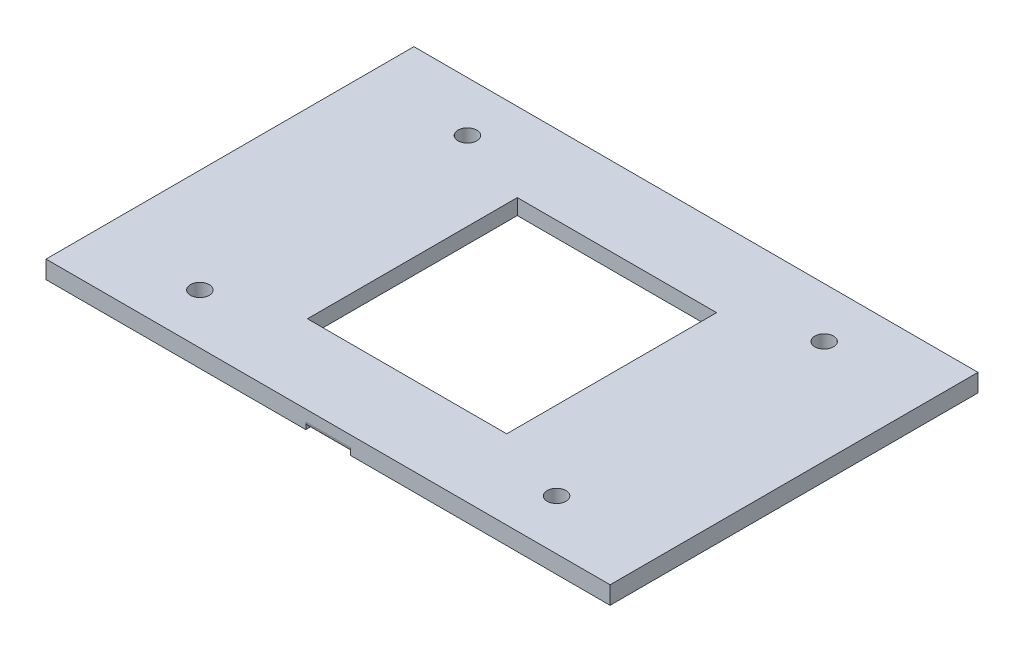
ISO-10303-21;
HEADER;
FILE_DESCRIPTION(('STEP AP214'),'2;1');
FILE_NAME('part.step','',(''),(''),'','','');
FILE_SCHEMA(('AUTOMOTIVE_DESIGN { 1 0 10303 214 1 1 1 1 }'));
ENDSEC;
DATA;
#1=APPLICATION_CONTEXT('core data for automotive mechanical design processes');
#2=APPLICATION_PROTOCOL_DEFINITION('international standard','automotive_design',2000,#1);
#3=PRODUCT_CONTEXT('',#1,'mechanical');
#4=PRODUCT('Part','Part','',(#3));
#5=PRODUCT_RELATED_PRODUCT_CATEGORY('part','',(#4));
#6=PRODUCT_DEFINITION_FORMATION('','',#4);
#7=PRODUCT_DEFINITION_CONTEXT('part definition',#1,'design');
#8=PRODUCT_DEFINITION('design','',#6,#7);
#9=PRODUCT_DEFINITION_SHAPE('','',#8);
#10=(LENGTH_UNIT() NAMED_UNIT(*) SI_UNIT(.MILLI.,.METRE.));
#11=(NAMED_UNIT(*) PLANE_ANGLE_UNIT() SI_UNIT($,.RADIAN.));
#12=(NAMED_UNIT(*) SI_UNIT($,.STERADIAN.) SOLID_ANGLE_UNIT());
#13=UNCERTAINTY_MEASURE_WITH_UNIT(LENGTH_MEASURE(1.E-05),#10,'distance_accuracy_value','');
#14=(GEOMETRIC_REPRESENTATION_CONTEXT(3) GLOBAL_UNCERTAINTY_ASSIGNED_CONTEXT((#13)) GLOBAL_UNIT_ASSIGNED_CONTEXT((#10,
#11,#12)) REPRESENTATION_CONTEXT('',''));
#15=CARTESIAN_POINT('',(0.,0.,0.));
#16=DIRECTION('',(0.,0.,1.));
#17=DIRECTION('',(1.,0.,0.));
#18=AXIS2_PLACEMENT_3D('',#15,#16,#17);
#19=CARTESIAN_POINT('',(0.,56.6459742680589,0.));
#20=DIRECTION('',(0.,-1.,0.));
#21=DIRECTION('',(0.,0.,-1.));
#22=AXIS2_PLACEMENT_3D('',#19,#20,#21);
#23=PLANE('',#22);
#24=DIRECTION('',(0.,0.,1.));
#25=VECTOR('',#24,1.);
#26=CARTESIAN_POINT('',(69.8089806938948,56.6459742680589,0.));
#27=LINE('',#26,#25);
#28=CARTESIAN_POINT('',(69.8089806938948,56.6459742680589,121.523129836377));
#29=VERTEX_POINT('',#28);
#30=CARTESIAN_POINT('',(69.8089806938948,56.6459742680589,130.773129836377));
#31=VERTEX_POINT('',#30);
#32=EDGE_CURVE('E322',#29,#31,#27,.T.);
#33=ORIENTED_EDGE('',*,*,#32,.F.);
#34=DIRECTION('',(1.,0.,0.));
#35=VECTOR('',#34,1.);
#36=CARTESIAN_POINT('',(0.,56.6459742680589,121.523129836377));
#37=LINE('',#36,#35);
#38=CARTESIAN_POINT('',(96.8089806938948,56.6459742680589,121.523129836377));
#39=VERTEX_POINT('',#38);
#40=EDGE_CURVE('E319',#29,#39,#37,.T.);
#41=ORIENTED_EDGE('',*,*,#40,.T.);
#42=DIRECTION('',(0.,0.,-1.));
#43=VECTOR('',#42,1.);
#44=CARTESIAN_POINT('',(96.8089806938948,56.6459742680589,0.));
#45=LINE('',#44,#43);
#46=CARTESIAN_POINT('',(96.8089806938948,56.6459742680589,94.5231298363772));
#47=VERTEX_POINT('',#46);
#48=EDGE_CURVE('E316',#39,#47,#45,.T.);
#49=ORIENTED_EDGE('',*,*,#48,.T.);
#50=DIRECTION('',(-1.,0.,0.));
#51=VECTOR('',#50,1.);
#52=CARTESIAN_POINT('',(0.,56.6459742680589,94.5231298363772));
#53=LINE('',#52,#51);
#54=CARTESIAN_POINT('',(116.808980693895,56.6459742680589,94.5231298363772));
#55=VERTEX_POINT('',#54);
#56=EDGE_CURVE('E313',#55,#47,#53,.T.);
#57=ORIENTED_EDGE('',*,*,#56,.F.);
#58=DIRECTION('',(0.,0.,1.));
#59=VECTOR('',#58,1.);
#60=CARTESIAN_POINT('',(116.808980693895,56.6459742680589,0.));
#61=LINE('',#60,#59);
#62=CARTESIAN_POINT('',(116.808980693895,56.6459742680589,84.5231298363773));
#63=VERTEX_POINT('',#62);
#64=EDGE_CURVE('E310',#63,#55,#61,.T.);
#65=ORIENTED_EDGE('',*,*,#64,.F.);
#66=DIRECTION('',(1.,0.,0.));
#67=VECTOR('',#66,1.);
#68=CARTESIAN_POINT('',(0.,56.6459742680589,84.5231298363773));
#69=LINE('',#68,#67);
#70=CARTESIAN_POINT('',(96.8089806938948,56.6459742680589,84.5231298363773));
#71=VERTEX_POINT('',#70);
#72=EDGE_CURVE('E307',#71,#63,#69,.T.);
#73=ORIENTED_EDGE('',*,*,#72,.F.);
#74=DIRECTION('',(0.,0.,-1.));
#75=VECTOR('',#74,1.);
#76=CARTESIAN_POINT('',(96.8089806938948,56.6459742680589,0.));
#77=LINE('',#76,#75);
#78=CARTESIAN_POINT('',(96.8089806938948,56.6459742680589,57.5231298363773));
#79=VERTEX_POINT('',#78);
#80=EDGE_CURVE('E304',#71,#79,#77,.T.);
#81=ORIENTED_EDGE('',*,*,#80,.T.);
#82=DIRECTION('',(-1.,0.,0.));
#83=VECTOR('',#82,1.);
#84=CARTESIAN_POINT('',(0.,56.6459742680589,57.5231298363773));
#85=LINE('',#84,#83);
#86=CARTESIAN_POINT('',(69.8089806938948,56.6459742680589,57.5231298363773));
#87=VERTEX_POINT('',#86);
#88=EDGE_CURVE('E301',#79,#87,#85,.T.);
#89=ORIENTED_EDGE('',*,*,#88,.T.);
#90=DIRECTION('',(0.,0.,-1.));
#91=VECTOR('',#90,1.);
#92=CARTESIAN_POINT('',(69.8089806938948,56.6459742680589,0.));
#93=LINE('',#92,#91);
#94=CARTESIAN_POINT('',(69.8089806938948,56.6459742680589,48.2731298363773));
#95=VERTEX_POINT('',#94);
#96=EDGE_CURVE('E298',#87,#95,#93,.T.);
#97=ORIENTED_EDGE('',*,*,#96,.T.);
#98=DIRECTION('',(1.,0.,0.));
#99=VECTOR('',#98,1.);
#100=CARTESIAN_POINT('',(1.55898069389482,56.6459742680589,48.2731298363773));
#101=LINE('',#100,#99);
#102=CARTESIAN_POINT('',(128.058980693895,56.6459742680589,48.2731298363773));
#103=VERTEX_POINT('',#102);
#104=EDGE_CURVE('E438',#95,#103,#101,.T.);
#105=ORIENTED_EDGE('',*,*,#104,.T.);
#106=DIRECTION('',(0.,0.,1.));
#107=VECTOR('',#106,1.);
#108=CARTESIAN_POINT('',(128.058980693895,56.6459742680589,48.2731298363773));
#109=LINE('',#108,#107);
#110=CARTESIAN_POINT('',(128.058980693895,56.6459742680589,130.773129836377));
#111=VERTEX_POINT('',#110);
#112=EDGE_CURVE('E437',#103,#111,#109,.T.);
#113=ORIENTED_EDGE('',*,*,#112,.T.);
#114=DIRECTION('',(-1.,0.,0.));
#115=VECTOR('',#114,1.);
#116=CARTESIAN_POINT('',(128.058980693895,56.6459742680589,130.773129836377));
#117=LINE('',#116,#115);
#118=EDGE_CURVE('E441',#111,#31,#117,.T.);
#119=ORIENTED_EDGE('',*,*,#118,.T.);
#120=EDGE_LOOP('',(#33,#41,#49,#57,#65,#73,#81,#89,#97,#105,#113,#119));
#121=FACE_BOUND('',#120,.T.);
#122=CARTESIAN_POINT('',(104.808980693895,56.6459742680589,119.523129836377));
#123=DIRECTION('',(0.,-1.,0.));
#124=DIRECTION('',(0.,0.,-1.));
#125=AXIS2_PLACEMENT_3D('',#122,#123,#124);
#126=CIRCLE('',#125,2.1);
#127=CARTESIAN_POINT('',(104.808980693895,56.6459742680589,117.423129836377));
#128=VERTEX_POINT('',#127);
#129=EDGE_CURVE('E390',#128,#128,#126,.T.);
#130=ORIENTED_EDGE('',*,*,#129,.F.);
#131=EDGE_LOOP('',(#130));
#132=FACE_BOUND('',#131,.T.);
#133=CARTESIAN_POINT('',(104.808980693895,56.6459742680589,59.5231298363773));
#134=DIRECTION('',(0.,-1.,0.));
#135=DIRECTION('',(0.,0.,-1.));
#136=AXIS2_PLACEMENT_3D('',#133,#134,#135);
#137=CIRCLE('',#136,2.1);
#138=CARTESIAN_POINT('',(104.808980693895,56.6459742680589,57.4231298363772));
#139=VERTEX_POINT('',#138);
#140=EDGE_CURVE('E402',#139,#139,#137,.T.);
#141=ORIENTED_EDGE('',*,*,#140,.F.);
#142=EDGE_LOOP('',(#141));
#143=FACE_BOUND('',#142,.T.);
#144=ADVANCED_FACE('F33',(#121,#132,#143),#23,.T.);
#145=CARTESIAN_POINT('',(1.55898069389482,56.6459742680589,48.2731298363773));
#146=DIRECTION('',(0.,0.,1.));
#147=DIRECTION('',(1.,0.,0.));
#148=AXIS2_PLACEMENT_3D('',#145,#146,#147);
#149=PLANE('',#148);
#150=DIRECTION('',(-1.,0.,0.));
#151=VECTOR('',#150,1.);
#152=CARTESIAN_POINT('',(59.8089806938948,58.1459742680589,48.2731298363773));
#153=LINE('',#152,#151);
#154=CARTESIAN_POINT('',(69.8089806938948,58.1459742680589,48.2731298363773));
#155=VERTEX_POINT('',#154);
#156=CARTESIAN_POINT('',(59.8089806938948,58.1459742680589,48.2731298363773));
#157=VERTEX_POINT('',#156);
#158=EDGE_CURVE('E469',#155,#157,#153,.T.);
#159=ORIENTED_EDGE('',*,*,#158,.T.);
#160=DIRECTION('',(0.,-1.,0.));
#161=VECTOR('',#160,1.);
#162=CARTESIAN_POINT('',(59.8089806938948,57.1459742680589,48.2731298363773));
#163=LINE('',#162,#161);
#164=CARTESIAN_POINT('',(59.8089806938948,56.6459742680589,48.2731298363773));
#165=VERTEX_POINT('',#164);
#166=EDGE_CURVE('E240',#157,#165,#163,.T.);
#167=ORIENTED_EDGE('',*,*,#166,.T.);
#168=CARTESIAN_POINT('',(1.55898069389482,56.6459742680589,48.2731298363773));
#169=VERTEX_POINT('',#168);
#170=EDGE_CURVE('E434',#169,#165,#101,.T.);
#171=ORIENTED_EDGE('',*,*,#170,.F.);
#172=DIRECTION('',(0.,1.,0.));
#173=VECTOR('',#172,1.);
#174=CARTESIAN_POINT('',(1.55898069389482,56.6459742680589,48.2731298363773));
#175=LINE('',#174,#173);
#176=CARTESIAN_POINT('',(1.55898069389482,60.645974268059,48.2731298363773));
#177=VERTEX_POINT('',#176);
#178=EDGE_CURVE('E446',#169,#177,#175,.T.);
#179=ORIENTED_EDGE('',*,*,#178,.T.);
#180=DIRECTION('',(1.,0.,0.));
#181=VECTOR('',#180,1.);
#182=CARTESIAN_POINT('',(1.55898069389482,60.645974268059,48.2731298363773));
#183=LINE('',#182,#181);
#184=CARTESIAN_POINT('',(128.058980693895,60.645974268059,48.2731298363773));
#185=VERTEX_POINT('',#184);
#186=EDGE_CURVE('E433',#177,#185,#183,.T.);
#187=ORIENTED_EDGE('',*,*,#186,.T.);
#188=DIRECTION('',(0.,1.,0.));
#189=VECTOR('',#188,1.);
#190=CARTESIAN_POINT('',(128.058980693895,56.6459742680589,48.2731298363773));
#191=LINE('',#190,#189);
#192=EDGE_CURVE('E463',#103,#185,#191,.T.);
#193=ORIENTED_EDGE('',*,*,#192,.F.);
#194=ORIENTED_EDGE('',*,*,#104,.F.);
#195=DIRECTION('',(0.,-1.,0.));
#196=VECTOR('',#195,1.);
#197=CARTESIAN_POINT('',(69.8089806938948,57.1459742680589,48.2731298363773));
#198=LINE('',#197,#196);
#199=EDGE_CURVE('E377',#155,#95,#198,.T.);
#200=ORIENTED_EDGE('',*,*,#199,.F.);
#201=EDGE_LOOP('',(#159,#167,#171,#179,#187,#193,#194,#200));
#202=FACE_BOUND('',#201,.T.);
#203=ADVANCED_FACE('F515',(#202),#149,.F.);
#204=CARTESIAN_POINT('',(42.4667055457354,56.6459742680589,65.9891010956235));
#205=DIRECTION('',(0.,0.,1.));
#206=DIRECTION('',(1.,0.,0.));
#207=AXIS2_PLACEMENT_3D('',#204,#205,#206);
#208=PLANE('',#207);
#209=DIRECTION('',(0.,1.,0.));
#210=VECTOR('',#209,1.);
#211=CARTESIAN_POINT('',(42.4667055457354,56.6459742680589,65.9891010956235));
#212=LINE('',#211,#210);
#213=CARTESIAN_POINT('',(42.4667055457354,57.1459742680589,65.9891010956235));
#214=VERTEX_POINT('',#213);
#215=CARTESIAN_POINT('',(42.4667055457354,60.645974268059,65.9891010956235));
#216=VERTEX_POINT('',#215);
#217=EDGE_CURVE('E425',#214,#216,#212,.T.);
#218=ORIENTED_EDGE('',*,*,#217,.F.);
#219=DIRECTION('',(1.,0.,0.));
#220=VECTOR('',#219,1.);
#221=CARTESIAN_POINT('',(42.4667055457354,57.1459742680589,65.9891010956235));
#222=LINE('',#221,#220);
#223=CARTESIAN_POINT('',(87.1512558420543,57.1459742680589,65.9891010956236));
#224=VERTEX_POINT('',#223);
#225=EDGE_CURVE('E386',#214,#224,#222,.T.);
#226=ORIENTED_EDGE('',*,*,#225,.T.);
#227=DIRECTION('',(0.,1.,0.));
#228=VECTOR('',#227,1.);
#229=CARTESIAN_POINT('',(87.1512558420543,56.6459742680589,65.9891010956236));
#230=LINE('',#229,#228);
#231=CARTESIAN_POINT('',(87.1512558420543,60.645974268059,65.9891010956236));
#232=VERTEX_POINT('',#231);
#233=EDGE_CURVE('E431',#224,#232,#230,.T.);
#234=ORIENTED_EDGE('',*,*,#233,.T.);
#235=DIRECTION('',(1.,0.,0.));
#236=VECTOR('',#235,1.);
#237=CARTESIAN_POINT('',(42.4667055457354,60.645974268059,65.9891010956235));
#238=LINE('',#237,#236);
#239=EDGE_CURVE('E411',#216,#232,#238,.T.);
#240=ORIENTED_EDGE('',*,*,#239,.F.);
#241=EDGE_LOOP('',(#218,#226,#234,#240));
#242=FACE_BOUND('',#241,.T.);
#243=ADVANCED_FACE('F581',(#242),#208,.T.);
#244=CARTESIAN_POINT('',(87.1512558420543,56.6459742680589,65.9891010956236));
#245=DIRECTION('',(-1.,0.,0.));
#246=DIRECTION('',(0.,0.,1.));
#247=AXIS2_PLACEMENT_3D('',#244,#245,#246);
#248=PLANE('',#247);
#249=ORIENTED_EDGE('',*,*,#233,.F.);
#250=DIRECTION('',(0.,0.,1.));
#251=VECTOR('',#250,1.);
#252=CARTESIAN_POINT('',(87.1512558420543,57.1459742680589,65.9891010956236));
#253=LINE('',#252,#251);
#254=CARTESIAN_POINT('',(87.1512558420543,57.1459742680589,113.057158577131));
#255=VERTEX_POINT('',#254);
#256=EDGE_CURVE('E383',#224,#255,#253,.T.);
#257=ORIENTED_EDGE('',*,*,#256,.T.);
#258=DIRECTION('',(0.,1.,0.));
#259=VECTOR('',#258,1.);
#260=CARTESIAN_POINT('',(87.1512558420543,56.6459742680589,113.057158577131));
#261=LINE('',#260,#259);
#262=CARTESIAN_POINT('',(87.1512558420543,60.645974268059,113.057158577131));
#263=VERTEX_POINT('',#262);
#264=EDGE_CURVE('E429',#255,#263,#261,.T.);
#265=ORIENTED_EDGE('',*,*,#264,.T.);
#266=DIRECTION('',(0.,0.,1.));
#267=VECTOR('',#266,1.);
#268=CARTESIAN_POINT('',(87.1512558420543,60.645974268059,65.9891010956236));
#269=LINE('',#268,#267);
#270=EDGE_CURVE('E416',#232,#263,#269,.T.);
#271=ORIENTED_EDGE('',*,*,#270,.F.);
#272=EDGE_LOOP('',(#249,#257,#265,#271));
#273=FACE_BOUND('',#272,.T.);
#274=ADVANCED_FACE('F596',(#273),#248,.T.);
#275=CARTESIAN_POINT('',(87.1512558420543,56.6459742680589,113.057158577131));
#276=DIRECTION('',(0.,0.,-1.));
#277=DIRECTION('',(-1.,0.,0.));
#278=AXIS2_PLACEMENT_3D('',#275,#276,#277);
#279=PLANE('',#278);
#280=ORIENTED_EDGE('',*,*,#264,.F.);
#281=DIRECTION('',(-1.,0.,0.));
#282=VECTOR('',#281,1.);
#283=CARTESIAN_POINT('',(87.1512558420543,57.1459742680589,113.057158577131));
#284=LINE('',#283,#282);
#285=CARTESIAN_POINT('',(42.4667055457354,57.1459742680589,113.057158577131));
#286=VERTEX_POINT('',#285);
#287=EDGE_CURVE('E346',#255,#286,#284,.T.);
#288=ORIENTED_EDGE('',*,*,#287,.T.);
#289=DIRECTION('',(0.,1.,0.));
#290=VECTOR('',#289,1.);
#291=CARTESIAN_POINT('',(42.4667055457354,56.6459742680589,113.057158577131));
#292=LINE('',#291,#290);
#293=CARTESIAN_POINT('',(42.4667055457354,60.645974268059,113.057158577131));
#294=VERTEX_POINT('',#293);
#295=EDGE_CURVE('E427',#286,#294,#292,.T.);
#296=ORIENTED_EDGE('',*,*,#295,.T.);
#297=DIRECTION('',(-1.,0.,0.));
#298=VECTOR('',#297,1.);
#299=CARTESIAN_POINT('',(87.1512558420543,60.645974268059,113.057158577131));
#300=LINE('',#299,#298);
#301=EDGE_CURVE('E419',#263,#294,#300,.T.);
#302=ORIENTED_EDGE('',*,*,#301,.F.);
#303=EDGE_LOOP('',(#280,#288,#296,#302));
#304=FACE_BOUND('',#303,.T.);
#305=ADVANCED_FACE('F590',(#304),#279,.T.);
#306=CARTESIAN_POINT('',(42.4667055457354,56.6459742680589,113.057158577131));
#307=DIRECTION('',(1.,0.,0.));
#308=DIRECTION('',(0.,0.,-1.));
#309=AXIS2_PLACEMENT_3D('',#306,#307,#308);
#310=PLANE('',#309);
#311=ORIENTED_EDGE('',*,*,#295,.F.);
#312=DIRECTION('',(0.,0.,-1.));
#313=VECTOR('',#312,1.);
#314=CARTESIAN_POINT('',(42.4667055457354,57.1459742680589,113.057158577131));
#315=LINE('',#314,#313);
#316=EDGE_CURVE('E466',#286,#214,#315,.T.);
#317=ORIENTED_EDGE('',*,*,#316,.T.);
#318=ORIENTED_EDGE('',*,*,#217,.T.);
#319=DIRECTION('',(0.,0.,-1.));
#320=VECTOR('',#319,1.);
#321=CARTESIAN_POINT('',(42.4667055457354,60.645974268059,113.057158577131));
#322=LINE('',#321,#320);
#323=EDGE_CURVE('E422',#294,#216,#322,.T.);
#324=ORIENTED_EDGE('',*,*,#323,.F.);
#325=EDGE_LOOP('',(#311,#317,#318,#324));
#326=FACE_BOUND('',#325,.T.);
#327=ADVANCED_FACE('F585',(#326),#310,.T.);
#328=DIRECTION('',(0.,0.,-1.));
#329=VECTOR('',#328,1.);
#330=CARTESIAN_POINT('',(59.8089806938948,56.6459742680589,0.));
#331=LINE('',#330,#329);
#332=CARTESIAN_POINT('',(59.8089806938948,56.6459742680589,130.773129836377));
#333=VERTEX_POINT('',#332);
#334=CARTESIAN_POINT('',(59.8089806938948,56.6459742680589,121.523129836377));
#335=VERTEX_POINT('',#334);
#336=EDGE_CURVE('E324',#333,#335,#331,.T.);
#337=ORIENTED_EDGE('',*,*,#336,.F.);
#338=CARTESIAN_POINT('',(1.55898069389482,56.6459742680589,130.773129836377));
#339=VERTEX_POINT('',#338);
#340=EDGE_CURVE('E440',#333,#339,#117,.T.);
#341=ORIENTED_EDGE('',*,*,#340,.T.);
#342=DIRECTION('',(0.,0.,-1.));
#343=VECTOR('',#342,1.);
#344=CARTESIAN_POINT('',(1.55898069389482,56.6459742680589,130.773129836377));
#345=LINE('',#344,#343);
#346=EDGE_CURVE('E444',#339,#169,#345,.T.);
#347=ORIENTED_EDGE('',*,*,#346,.T.);
#348=ORIENTED_EDGE('',*,*,#170,.T.);
#349=DIRECTION('',(0.,0.,-1.));
#350=VECTOR('',#349,1.);
#351=CARTESIAN_POINT('',(59.8089806938948,56.6459742680589,0.));
#352=LINE('',#351,#350);
#353=CARTESIAN_POINT('',(59.8089806938948,56.6459742680589,57.5231298363773));
#354=VERTEX_POINT('',#353);
#355=EDGE_CURVE('E296',#354,#165,#352,.T.);
#356=ORIENTED_EDGE('',*,*,#355,.F.);
#357=DIRECTION('',(-1.,0.,0.));
#358=VECTOR('',#357,1.);
#359=CARTESIAN_POINT('',(0.,56.6459742680589,57.5231298363773));
#360=LINE('',#359,#358);
#361=CARTESIAN_POINT('',(32.8089806938948,56.6459742680589,57.5231298363773));
#362=VERTEX_POINT('',#361);
#363=EDGE_CURVE('E236',#354,#362,#360,.T.);
#364=ORIENTED_EDGE('',*,*,#363,.T.);
#365=DIRECTION('',(0.,0.,1.));
#366=VECTOR('',#365,1.);
#367=CARTESIAN_POINT('',(32.8089806938948,56.6459742680589,0.));
#368=LINE('',#367,#366);
#369=CARTESIAN_POINT('',(32.8089806938948,56.6459742680589,84.5231298363773));
#370=VERTEX_POINT('',#369);
#371=EDGE_CURVE('E249',#362,#370,#368,.T.);
#372=ORIENTED_EDGE('',*,*,#371,.T.);
#373=DIRECTION('',(1.,0.,0.));
#374=VECTOR('',#373,1.);
#375=CARTESIAN_POINT('',(0.,56.6459742680589,84.5231298363773));
#376=LINE('',#375,#374);
#377=CARTESIAN_POINT('',(12.8089806938948,56.6459742680589,84.5231298363773));
#378=VERTEX_POINT('',#377);
#379=EDGE_CURVE('E339',#378,#370,#376,.T.);
#380=ORIENTED_EDGE('',*,*,#379,.F.);
#381=DIRECTION('',(0.,0.,-1.));
#382=VECTOR('',#381,1.);
#383=CARTESIAN_POINT('',(12.8089806938948,56.6459742680589,0.));
#384=LINE('',#383,#382);
#385=CARTESIAN_POINT('',(12.8089806938948,56.6459742680589,94.5231298363772));
#386=VERTEX_POINT('',#385);
#387=EDGE_CURVE('E336',#386,#378,#384,.T.);
#388=ORIENTED_EDGE('',*,*,#387,.F.);
#389=DIRECTION('',(-1.,0.,0.));
#390=VECTOR('',#389,1.);
#391=CARTESIAN_POINT('',(0.,56.6459742680589,94.5231298363772));
#392=LINE('',#391,#390);
#393=CARTESIAN_POINT('',(32.8089806938948,56.6459742680589,94.5231298363772));
#394=VERTEX_POINT('',#393);
#395=EDGE_CURVE('E333',#394,#386,#392,.T.);
#396=ORIENTED_EDGE('',*,*,#395,.F.);
#397=DIRECTION('',(0.,0.,1.));
#398=VECTOR('',#397,1.);
#399=CARTESIAN_POINT('',(32.8089806938948,56.6459742680589,0.));
#400=LINE('',#399,#398);
#401=CARTESIAN_POINT('',(32.8089806938948,56.6459742680589,121.523129836377));
#402=VERTEX_POINT('',#401);
#403=EDGE_CURVE('E330',#394,#402,#400,.T.);
#404=ORIENTED_EDGE('',*,*,#403,.T.);
#405=DIRECTION('',(1.,0.,0.));
#406=VECTOR('',#405,1.);
#407=CARTESIAN_POINT('',(0.,56.6459742680589,121.523129836377));
#408=LINE('',#407,#406);
#409=EDGE_CURVE('E327',#402,#335,#408,.T.);
#410=ORIENTED_EDGE('',*,*,#409,.T.);
#411=EDGE_LOOP('',(#337,#341,#347,#348,#356,#364,#372,#380,#388,#396,#404,#410));
#412=FACE_BOUND('',#411,.T.);
#413=CARTESIAN_POINT('',(24.8089806938948,56.6459742680589,119.523129836377));
#414=DIRECTION('',(0.,-1.,0.));
#415=DIRECTION('',(0.,0.,-1.));
#416=AXIS2_PLACEMENT_3D('',#413,#414,#415);
#417=CIRCLE('',#416,2.09999999999998);
#418=CARTESIAN_POINT('',(24.8089806938948,56.6459742680589,117.423129836377));
#419=VERTEX_POINT('',#418);
#420=EDGE_CURVE('E396',#419,#419,#417,.T.);
#421=ORIENTED_EDGE('',*,*,#420,.F.);
#422=EDGE_LOOP('',(#421));
#423=FACE_BOUND('',#422,.T.);
#424=CARTESIAN_POINT('',(24.8089806938948,56.6459742680589,59.5231298363773));
#425=DIRECTION('',(0.,-1.,0.));
#426=DIRECTION('',(0.,0.,-1.));
#427=AXIS2_PLACEMENT_3D('',#424,#425,#426);
#428=CIRCLE('',#427,2.1);
#429=CARTESIAN_POINT('',(24.8089806938948,56.6459742680589,57.4231298363773));
#430=VERTEX_POINT('',#429);
#431=EDGE_CURVE('E408',#430,#430,#428,.T.);
#432=ORIENTED_EDGE('',*,*,#431,.F.);
#433=EDGE_LOOP('',(#432));
#434=FACE_BOUND('',#433,.T.);
#435=ADVANCED_FACE('F517',(#412,#423,#434),#23,.T.);
#436=CARTESIAN_POINT('',(0.,60.645974268059,0.));
#437=DIRECTION('',(0.,-1.,0.));
#438=DIRECTION('',(0.,0.,-1.));
#439=AXIS2_PLACEMENT_3D('',#436,#437,#438);
#440=PLANE('',#439);
#441=ORIENTED_EDGE('',*,*,#186,.F.);
#442=DIRECTION('',(0.,0.,-1.));
#443=VECTOR('',#442,1.);
#444=CARTESIAN_POINT('',(1.55898069389482,60.645974268059,130.773129836377));
#445=LINE('',#444,#443);
#446=CARTESIAN_POINT('',(1.55898069389482,60.645974268059,130.773129836377));
#447=VERTEX_POINT('',#446);
#448=EDGE_CURVE('E453',#447,#177,#445,.T.);
#449=ORIENTED_EDGE('',*,*,#448,.F.);
#450=DIRECTION('',(-1.,0.,0.));
#451=VECTOR('',#450,1.);
#452=CARTESIAN_POINT('',(128.058980693895,60.645974268059,130.773129836377));
#453=LINE('',#452,#451);
#454=CARTESIAN_POINT('',(128.058980693895,60.645974268059,130.773129836377));
#455=VERTEX_POINT('',#454);
#456=EDGE_CURVE('E451',#455,#447,#453,.T.);
#457=ORIENTED_EDGE('',*,*,#456,.F.);
#458=DIRECTION('',(0.,0.,1.));
#459=VECTOR('',#458,1.);
#460=CARTESIAN_POINT('',(128.058980693895,60.645974268059,48.2731298363773));
#461=LINE('',#460,#459);
#462=EDGE_CURVE('E449',#185,#455,#461,.T.);
#463=ORIENTED_EDGE('',*,*,#462,.F.);
#464=EDGE_LOOP('',(#441,#449,#457,#463));
#465=FACE_BOUND('',#464,.T.);
#466=ORIENTED_EDGE('',*,*,#239,.T.);
#467=ORIENTED_EDGE('',*,*,#270,.T.);
#468=ORIENTED_EDGE('',*,*,#301,.T.);
#469=ORIENTED_EDGE('',*,*,#323,.T.);
#470=EDGE_LOOP('',(#466,#467,#468,#469));
#471=FACE_BOUND('',#470,.T.);
#472=CARTESIAN_POINT('',(24.8089806938948,60.645974268059,59.5231298363773));
#473=DIRECTION('',(0.,-1.,0.));
#474=DIRECTION('',(0.,0.,-1.));
#475=AXIS2_PLACEMENT_3D('',#472,#473,#474);
#476=CIRCLE('',#475,2.1);
#477=CARTESIAN_POINT('',(24.8089806938948,60.645974268059,57.4231298363773));
#478=VERTEX_POINT('',#477);
#479=EDGE_CURVE('E405',#478,#478,#476,.T.);
#480=ORIENTED_EDGE('',*,*,#479,.T.);
#481=EDGE_LOOP('',(#480));
#482=FACE_BOUND('',#481,.T.);
#483=CARTESIAN_POINT('',(104.808980693895,60.645974268059,59.5231298363773));
#484=DIRECTION('',(0.,-1.,0.));
#485=DIRECTION('',(0.,0.,-1.));
#486=AXIS2_PLACEMENT_3D('',#483,#484,#485);
#487=CIRCLE('',#486,2.1);
#488=CARTESIAN_POINT('',(104.808980693895,60.645974268059,57.4231298363772));
#489=VERTEX_POINT('',#488);
#490=EDGE_CURVE('E399',#489,#489,#487,.T.);
#491=ORIENTED_EDGE('',*,*,#490,.T.);
#492=EDGE_LOOP('',(#491));
#493=FACE_BOUND('',#492,.T.);
#494=CARTESIAN_POINT('',(24.8089806938948,60.645974268059,119.523129836377));
#495=DIRECTION('',(0.,-1.,0.));
#496=DIRECTION('',(0.,0.,-1.));
#497=AXIS2_PLACEMENT_3D('',#494,#495,#496);
#498=CIRCLE('',#497,2.09999999999998);
#499=CARTESIAN_POINT('',(24.8089806938948,60.645974268059,117.423129836377));
#500=VERTEX_POINT('',#499);
#501=EDGE_CURVE('E393',#500,#500,#498,.T.);
#502=ORIENTED_EDGE('',*,*,#501,.T.);
#503=EDGE_LOOP('',(#502));
#504=FACE_BOUND('',#503,.T.);
#505=CARTESIAN_POINT('',(104.808980693895,60.645974268059,119.523129836377));
#506=DIRECTION('',(0.,-1.,0.));
#507=DIRECTION('',(0.,0.,-1.));
#508=AXIS2_PLACEMENT_3D('',#505,#506,#507);
#509=CIRCLE('',#508,2.1);
#510=CARTESIAN_POINT('',(104.808980693895,60.645974268059,117.423129836377));
#511=VERTEX_POINT('',#510);
#512=EDGE_CURVE('E389',#511,#511,#509,.T.);
#513=ORIENTED_EDGE('',*,*,#512,.T.);
#514=EDGE_LOOP('',(#513));
#515=FACE_BOUND('',#514,.T.);
#516=ADVANCED_FACE('F507',(#465,#471,#482,#493,#504,#515),#440,.F.);
#517=CARTESIAN_POINT('',(128.058980693895,56.6459742680589,48.2731298363773));
#518=DIRECTION('',(-1.,0.,0.));
#519=DIRECTION('',(0.,0.,1.));
#520=AXIS2_PLACEMENT_3D('',#517,#518,#519);
#521=PLANE('',#520);
#522=ORIENTED_EDGE('',*,*,#462,.T.);
#523=DIRECTION('',(0.,1.,0.));
#524=VECTOR('',#523,1.);
#525=CARTESIAN_POINT('',(128.058980693895,56.6459742680589,130.773129836377));
#526=LINE('',#525,#524);
#527=EDGE_CURVE('E460',#111,#455,#526,.T.);
#528=ORIENTED_EDGE('',*,*,#527,.F.);
#529=ORIENTED_EDGE('',*,*,#112,.F.);
#530=ORIENTED_EDGE('',*,*,#192,.T.);
#531=EDGE_LOOP('',(#522,#528,#529,#530));
#532=FACE_BOUND('',#531,.T.);
#533=ADVANCED_FACE('F501',(#532),#521,.F.);
#534=CARTESIAN_POINT('',(128.058980693895,56.6459742680589,130.773129836377));
#535=DIRECTION('',(0.,0.,-1.));
#536=DIRECTION('',(-1.,0.,0.));
#537=AXIS2_PLACEMENT_3D('',#534,#535,#536);
#538=PLANE('',#537);
#539=DIRECTION('',(0.,-1.,0.));
#540=VECTOR('',#539,1.);
#541=CARTESIAN_POINT('',(59.8089806938948,57.1459742680589,130.773129836377));
#542=LINE('',#541,#540);
#543=CARTESIAN_POINT('',(59.8089806938948,58.1459742680589,130.773129836377));
#544=VERTEX_POINT('',#543);
#545=EDGE_CURVE('E48',#544,#333,#542,.T.);
#546=ORIENTED_EDGE('',*,*,#545,.F.);
#547=DIRECTION('',(-1.,0.,0.));
#548=VECTOR('',#547,1.);
#549=CARTESIAN_POINT('',(69.8089806938948,58.1459742680589,130.773129836377));
#550=LINE('',#549,#548);
#551=CARTESIAN_POINT('',(69.8089806938948,58.1459742680589,130.773129836377));
#552=VERTEX_POINT('',#551);
#553=EDGE_CURVE('E477',#544,#552,#550,.F.);
#554=ORIENTED_EDGE('',*,*,#553,.T.);
#555=DIRECTION('',(0.,-1.,0.));
#556=VECTOR('',#555,1.);
#557=CARTESIAN_POINT('',(69.8089806938948,57.1459742680589,130.773129836377));
#558=LINE('',#557,#556);
#559=EDGE_CURVE('E55',#552,#31,#558,.T.);
#560=ORIENTED_EDGE('',*,*,#559,.T.);
#561=ORIENTED_EDGE('',*,*,#118,.F.);
#562=ORIENTED_EDGE('',*,*,#527,.T.);
#563=ORIENTED_EDGE('',*,*,#456,.T.);
#564=DIRECTION('',(0.,1.,0.));
#565=VECTOR('',#564,1.);
#566=CARTESIAN_POINT('',(1.55898069389482,56.6459742680589,130.773129836377));
#567=LINE('',#566,#565);
#568=EDGE_CURVE('E457',#339,#447,#567,.T.);
#569=ORIENTED_EDGE('',*,*,#568,.F.);
#570=ORIENTED_EDGE('',*,*,#340,.F.);
#571=EDGE_LOOP('',(#546,#554,#560,#561,#562,#563,#569,#570));
#572=FACE_BOUND('',#571,.T.);
#573=ADVANCED_FACE('F491',(#572),#538,.F.);
#574=CARTESIAN_POINT('',(1.55898069389482,56.6459742680589,130.773129836377));
#575=DIRECTION('',(1.,0.,0.));
#576=DIRECTION('',(0.,0.,-1.));
#577=AXIS2_PLACEMENT_3D('',#574,#575,#576);
#578=PLANE('',#577);
#579=ORIENTED_EDGE('',*,*,#448,.T.);
#580=ORIENTED_EDGE('',*,*,#178,.F.);
#581=ORIENTED_EDGE('',*,*,#346,.F.);
#582=ORIENTED_EDGE('',*,*,#568,.T.);
#583=EDGE_LOOP('',(#579,#580,#581,#582));
#584=FACE_BOUND('',#583,.T.);
#585=ADVANCED_FACE('F511',(#584),#578,.F.);
#586=CARTESIAN_POINT('',(24.8089806938948,56.6459742680589,59.5231298363773));
#587=DIRECTION('',(0.,1.,0.));
#588=DIRECTION('',(0.,0.,1.));
#589=AXIS2_PLACEMENT_3D('',#586,#587,#588);
#590=CYLINDRICAL_SURFACE('',#589,2.1);
#591=ORIENTED_EDGE('',*,*,#431,.T.);
#592=EDGE_LOOP('',(#591));
#593=FACE_BOUND('',#592,.T.);
#594=ORIENTED_EDGE('',*,*,#479,.F.);
#595=EDGE_LOOP('',(#594));
#596=FACE_BOUND('',#595,.T.);
#597=ADVANCED_FACE('F601',(#593,#596),#590,.F.);
#598=CARTESIAN_POINT('',(104.808980693895,56.6459742680589,59.5231298363773));
#599=DIRECTION('',(0.,1.,0.));
#600=DIRECTION('',(0.,0.,1.));
#601=AXIS2_PLACEMENT_3D('',#598,#599,#600);
#602=CYLINDRICAL_SURFACE('',#601,2.1);
#603=ORIENTED_EDGE('',*,*,#140,.T.);
#604=EDGE_LOOP('',(#603));
#605=FACE_BOUND('',#604,.T.);
#606=ORIENTED_EDGE('',*,*,#490,.F.);
#607=EDGE_LOOP('',(#606));
#608=FACE_BOUND('',#607,.T.);
#609=ADVANCED_FACE('F637',(#605,#608),#602,.F.);
#610=CARTESIAN_POINT('',(24.8089806938948,56.6459742680589,119.523129836377));
#611=DIRECTION('',(0.,1.,0.));
#612=DIRECTION('',(0.,0.,1.));
#613=AXIS2_PLACEMENT_3D('',#610,#611,#612);
#614=CYLINDRICAL_SURFACE('',#613,2.09999999999998);
#615=ORIENTED_EDGE('',*,*,#420,.T.);
#616=EDGE_LOOP('',(#615));
#617=FACE_BOUND('',#616,.T.);
#618=ORIENTED_EDGE('',*,*,#501,.F.);
#619=EDGE_LOOP('',(#618));
#620=FACE_BOUND('',#619,.T.);
#621=ADVANCED_FACE('F628',(#617,#620),#614,.F.);
#622=CARTESIAN_POINT('',(104.808980693895,56.6459742680589,119.523129836377));
#623=DIRECTION('',(0.,1.,0.));
#624=DIRECTION('',(0.,0.,1.));
#625=AXIS2_PLACEMENT_3D('',#622,#623,#624);
#626=CYLINDRICAL_SURFACE('',#625,2.1);
#627=ORIENTED_EDGE('',*,*,#129,.T.);
#628=EDGE_LOOP('',(#627));
#629=FACE_BOUND('',#628,.T.);
#630=ORIENTED_EDGE('',*,*,#512,.F.);
#631=EDGE_LOOP('',(#630));
#632=FACE_BOUND('',#631,.T.);
#633=ADVANCED_FACE('F626',(#629,#632),#626,.F.);
#634=CARTESIAN_POINT('',(0.,57.1459742680589,57.5231298363773));
#635=DIRECTION('',(0.,0.,1.));
#636=DIRECTION('',(1.,0.,0.));
#637=AXIS2_PLACEMENT_3D('',#634,#635,#636);
#638=PLANE('',#637);
#639=ORIENTED_EDGE('',*,*,#363,.F.);
#640=DIRECTION('',(0.,-1.,0.));
#641=VECTOR('',#640,1.);
#642=CARTESIAN_POINT('',(59.8089806938948,57.1459742680589,57.5231298363773));
#643=LINE('',#642,#641);
#644=CARTESIAN_POINT('',(59.8089806938948,57.1459742680589,57.5231298363773));
#645=VERTEX_POINT('',#644);
#646=EDGE_CURVE('E229',#645,#354,#643,.T.);
#647=ORIENTED_EDGE('',*,*,#646,.F.);
#648=DIRECTION('',(-1.,0.,0.));
#649=VECTOR('',#648,1.);
#650=CARTESIAN_POINT('',(0.,57.1459742680589,57.5231298363773));
#651=LINE('',#650,#649);
#652=CARTESIAN_POINT('',(32.8089806938948,57.1459742680589,57.5231298363773));
#653=VERTEX_POINT('',#652);
#654=EDGE_CURVE('E233',#645,#653,#651,.T.);
#655=ORIENTED_EDGE('',*,*,#654,.T.);
#656=DIRECTION('',(0.,-1.,0.));
#657=VECTOR('',#656,1.);
#658=CARTESIAN_POINT('',(32.8089806938948,57.1459742680589,57.5231298363773));
#659=LINE('',#658,#657);
#660=EDGE_CURVE('E344',#653,#362,#659,.T.);
#661=ORIENTED_EDGE('',*,*,#660,.T.);
#662=EDGE_LOOP('',(#639,#647,#655,#661));
#663=FACE_BOUND('',#662,.T.);
#664=ADVANCED_FACE('F231',(#663),#638,.T.);
#665=CARTESIAN_POINT('',(32.8089806938948,57.1459742680589,0.));
#666=DIRECTION('',(1.,0.,0.));
#667=DIRECTION('',(0.,0.,-1.));
#668=AXIS2_PLACEMENT_3D('',#665,#666,#667);
#669=PLANE('',#668);
#670=ORIENTED_EDGE('',*,*,#371,.F.);
#671=ORIENTED_EDGE('',*,*,#660,.F.);
#672=DIRECTION('',(0.,0.,1.));
#673=VECTOR('',#672,1.);
#674=CARTESIAN_POINT('',(32.8089806938948,57.1459742680589,0.));
#675=LINE('',#674,#673);
#676=CARTESIAN_POINT('',(32.8089806938948,57.1459742680589,84.5231298363773));
#677=VERTEX_POINT('',#676);
#678=EDGE_CURVE('E241',#653,#677,#675,.T.);
#679=ORIENTED_EDGE('',*,*,#678,.T.);
#680=DIRECTION('',(0.,-1.,0.));
#681=VECTOR('',#680,1.);
#682=CARTESIAN_POINT('',(32.8089806938948,57.1459742680589,84.5231298363773));
#683=LINE('',#682,#681);
#684=EDGE_CURVE('E347',#677,#370,#683,.T.);
#685=ORIENTED_EDGE('',*,*,#684,.T.);
#686=EDGE_LOOP('',(#670,#671,#679,#685));
#687=FACE_BOUND('',#686,.T.);
#688=ADVANCED_FACE('F635',(#687),#669,.T.);
#689=CARTESIAN_POINT('',(0.,57.1459742680589,84.5231298363773));
#690=DIRECTION('',(0.,0.,-1.));
#691=DIRECTION('',(-1.,0.,0.));
#692=AXIS2_PLACEMENT_3D('',#689,#690,#691);
#693=PLANE('',#692);
#694=ORIENTED_EDGE('',*,*,#379,.T.);
#695=ORIENTED_EDGE('',*,*,#684,.F.);
#696=DIRECTION('',(1.,0.,0.));
#697=VECTOR('',#696,1.);
#698=CARTESIAN_POINT('',(0.,57.1459742680589,84.5231298363773));
#699=LINE('',#698,#697);
#700=CARTESIAN_POINT('',(12.8089806938948,57.1459742680589,84.5231298363773));
#701=VERTEX_POINT('',#700);
#702=EDGE_CURVE('E292',#701,#677,#699,.T.);
#703=ORIENTED_EDGE('',*,*,#702,.F.);
#704=DIRECTION('',(0.,-1.,0.));
#705=VECTOR('',#704,1.);
#706=CARTESIAN_POINT('',(12.8089806938948,57.1459742680589,84.5231298363773));
#707=LINE('',#706,#705);
#708=EDGE_CURVE('E349',#701,#378,#707,.T.);
#709=ORIENTED_EDGE('',*,*,#708,.T.);
#710=EDGE_LOOP('',(#694,#695,#703,#709));
#711=FACE_BOUND('',#710,.T.);
#712=ADVANCED_FACE('F758',(#711),#693,.F.);
#713=CARTESIAN_POINT('',(12.8089806938948,57.1459742680589,0.));
#714=DIRECTION('',(-1.,0.,0.));
#715=DIRECTION('',(0.,0.,1.));
#716=AXIS2_PLACEMENT_3D('',#713,#714,#715);
#717=PLANE('',#716);
#718=ORIENTED_EDGE('',*,*,#387,.T.);
#719=ORIENTED_EDGE('',*,*,#708,.F.);
#720=DIRECTION('',(0.,0.,-1.));
#721=VECTOR('',#720,1.);
#722=CARTESIAN_POINT('',(12.8089806938948,57.1459742680589,0.));
#723=LINE('',#722,#721);
#724=CARTESIAN_POINT('',(12.8089806938948,57.1459742680589,94.5231298363772));
#725=VERTEX_POINT('',#724);
#726=EDGE_CURVE('E289',#725,#701,#723,.T.);
#727=ORIENTED_EDGE('',*,*,#726,.F.);
#728=DIRECTION('',(0.,-1.,0.));
#729=VECTOR('',#728,1.);
#730=CARTESIAN_POINT('',(12.8089806938948,57.1459742680589,94.5231298363772));
#731=LINE('',#730,#729);
#732=EDGE_CURVE('E351',#725,#386,#731,.T.);
#733=ORIENTED_EDGE('',*,*,#732,.T.);
#734=EDGE_LOOP('',(#718,#719,#727,#733));
#735=FACE_BOUND('',#734,.T.);
#736=ADVANCED_FACE('F754',(#735),#717,.F.);
#737=CARTESIAN_POINT('',(0.,57.1459742680589,94.5231298363772));
#738=DIRECTION('',(0.,0.,1.));
#739=DIRECTION('',(1.,0.,0.));
#740=AXIS2_PLACEMENT_3D('',#737,#738,#739);
#741=PLANE('',#740);
#742=ORIENTED_EDGE('',*,*,#395,.T.);
#743=ORIENTED_EDGE('',*,*,#732,.F.);
#744=DIRECTION('',(-1.,0.,0.));
#745=VECTOR('',#744,1.);
#746=CARTESIAN_POINT('',(0.,57.1459742680589,94.5231298363772));
#747=LINE('',#746,#745);
#748=CARTESIAN_POINT('',(32.8089806938948,57.1459742680589,94.5231298363772));
#749=VERTEX_POINT('',#748);
#750=EDGE_CURVE('E286',#749,#725,#747,.T.);
#751=ORIENTED_EDGE('',*,*,#750,.F.);
#752=DIRECTION('',(0.,-1.,0.));
#753=VECTOR('',#752,1.);
#754=CARTESIAN_POINT('',(32.8089806938948,57.1459742680589,94.5231298363772));
#755=LINE('',#754,#753);
#756=EDGE_CURVE('E353',#749,#394,#755,.T.);
#757=ORIENTED_EDGE('',*,*,#756,.T.);
#758=EDGE_LOOP('',(#742,#743,#751,#757));
#759=FACE_BOUND('',#758,.T.);
#760=ADVANCED_FACE('F750',(#759),#741,.F.);
#761=CARTESIAN_POINT('',(32.8089806938948,57.1459742680589,0.));
#762=DIRECTION('',(1.,0.,0.));
#763=DIRECTION('',(0.,0.,-1.));
#764=AXIS2_PLACEMENT_3D('',#761,#762,#763);
#765=PLANE('',#764);
#766=ORIENTED_EDGE('',*,*,#403,.F.);
#767=ORIENTED_EDGE('',*,*,#756,.F.);
#768=DIRECTION('',(0.,0.,1.));
#769=VECTOR('',#768,1.);
#770=CARTESIAN_POINT('',(32.8089806938948,57.1459742680589,0.));
#771=LINE('',#770,#769);
#772=CARTESIAN_POINT('',(32.8089806938948,57.1459742680589,121.523129836377));
#773=VERTEX_POINT('',#772);
#774=EDGE_CURVE('E284',#749,#773,#771,.T.);
#775=ORIENTED_EDGE('',*,*,#774,.T.);
#776=DIRECTION('',(0.,-1.,0.));
#777=VECTOR('',#776,1.);
#778=CARTESIAN_POINT('',(32.8089806938948,57.1459742680589,121.523129836377));
#779=LINE('',#778,#777);
#780=EDGE_CURVE('E355',#773,#402,#779,.T.);
#781=ORIENTED_EDGE('',*,*,#780,.T.);
#782=EDGE_LOOP('',(#766,#767,#775,#781));
#783=FACE_BOUND('',#782,.T.);
#784=ADVANCED_FACE('F747',(#783),#765,.T.);
#785=CARTESIAN_POINT('',(0.,57.1459742680589,121.523129836377));
#786=DIRECTION('',(0.,0.,-1.));
#787=DIRECTION('',(-1.,0.,0.));
#788=AXIS2_PLACEMENT_3D('',#785,#786,#787);
#789=PLANE('',#788);
#790=ORIENTED_EDGE('',*,*,#409,.F.);
#791=ORIENTED_EDGE('',*,*,#780,.F.);
#792=DIRECTION('',(1.,0.,0.));
#793=VECTOR('',#792,1.);
#794=CARTESIAN_POINT('',(0.,57.1459742680589,121.523129836377));
#795=LINE('',#794,#793);
#796=CARTESIAN_POINT('',(59.8089806938948,57.1459742680589,121.523129836377));
#797=VERTEX_POINT('',#796);
#798=EDGE_CURVE('E281',#773,#797,#795,.T.);
#799=ORIENTED_EDGE('',*,*,#798,.T.);
#800=DIRECTION('',(0.,-1.,0.));
#801=VECTOR('',#800,1.);
#802=CARTESIAN_POINT('',(59.8089806938948,57.1459742680589,121.523129836377));
#803=LINE('',#802,#801);
#804=EDGE_CURVE('E357',#797,#335,#803,.T.);
#805=ORIENTED_EDGE('',*,*,#804,.T.);
#806=EDGE_LOOP('',(#790,#791,#799,#805));
#807=FACE_BOUND('',#806,.T.);
#808=ADVANCED_FACE('F521',(#807),#789,.T.);
#809=CARTESIAN_POINT('',(59.8089806938948,57.1459742680589,0.));
#810=DIRECTION('',(-1.,0.,0.));
#811=DIRECTION('',(0.,0.,1.));
#812=AXIS2_PLACEMENT_3D('',#809,#810,#811);
#813=PLANE('',#812);
#814=ORIENTED_EDGE('',*,*,#336,.T.);
#815=ORIENTED_EDGE('',*,*,#804,.F.);
#816=DIRECTION('',(0.,0.,-1.));
#817=VECTOR('',#816,1.);
#818=CARTESIAN_POINT('',(59.8089806938948,57.1459742680589,0.));
#819=LINE('',#818,#817);
#820=CARTESIAN_POINT('',(59.8089806938948,57.1459742680589,129.773129836377));
#821=VERTEX_POINT('',#820);
#822=EDGE_CURVE('E279',#821,#797,#819,.T.);
#823=ORIENTED_EDGE('',*,*,#822,.F.);
#824=CARTESIAN_POINT('',(59.8089806938948,58.1459742680589,129.773129836377));
#825=DIRECTION('',(-1.,0.,0.));
#826=DIRECTION('',(0.,0.,1.));
#827=AXIS2_PLACEMENT_3D('',#824,#825,#826);
#828=CIRCLE('',#827,1.);
#829=EDGE_CURVE('E41',#821,#544,#828,.T.);
#830=ORIENTED_EDGE('',*,*,#829,.T.);
#831=ORIENTED_EDGE('',*,*,#545,.T.);
#832=EDGE_LOOP('',(#814,#815,#823,#830,#831));
#833=FACE_BOUND('',#832,.T.);
#834=ADVANCED_FACE('F485',(#833),#813,.F.);
#835=CARTESIAN_POINT('',(69.8089806938948,57.1459742680589,0.));
#836=DIRECTION('',(1.,0.,0.));
#837=DIRECTION('',(0.,0.,-1.));
#838=AXIS2_PLACEMENT_3D('',#835,#836,#837);
#839=PLANE('',#838);
#840=ORIENTED_EDGE('',*,*,#32,.T.);
#841=ORIENTED_EDGE('',*,*,#559,.F.);
#842=CARTESIAN_POINT('',(69.8089806938948,58.1459742680589,129.773129836377));
#843=DIRECTION('',(1.,0.,0.));
#844=DIRECTION('',(0.,0.,-1.));
#845=AXIS2_PLACEMENT_3D('',#842,#843,#844);
#846=CIRCLE('',#845,1.);
#847=CARTESIAN_POINT('',(69.8089806938948,57.1459742680589,129.773129836377));
#848=VERTEX_POINT('',#847);
#849=EDGE_CURVE('E11',#552,#848,#846,.T.);
#850=ORIENTED_EDGE('',*,*,#849,.T.);
#851=DIRECTION('',(0.,0.,1.));
#852=VECTOR('',#851,1.);
#853=CARTESIAN_POINT('',(69.8089806938948,57.1459742680589,0.));
#854=LINE('',#853,#852);
#855=CARTESIAN_POINT('',(69.8089806938948,57.1459742680589,121.523129836377));
#856=VERTEX_POINT('',#855);
#857=EDGE_CURVE('E276',#856,#848,#854,.T.);
#858=ORIENTED_EDGE('',*,*,#857,.F.);
#859=DIRECTION('',(0.,-1.,0.));
#860=VECTOR('',#859,1.);
#861=CARTESIAN_POINT('',(69.8089806938948,57.1459742680589,121.523129836377));
#862=LINE('',#861,#860);
#863=EDGE_CURVE('E361',#856,#29,#862,.T.);
#864=ORIENTED_EDGE('',*,*,#863,.T.);
#865=EDGE_LOOP('',(#840,#841,#850,#858,#864));
#866=FACE_BOUND('',#865,.T.);
#867=ADVANCED_FACE('F529',(#866),#839,.F.);
#868=CARTESIAN_POINT('',(0.,57.1459742680589,121.523129836377));
#869=DIRECTION('',(0.,0.,-1.));
#870=DIRECTION('',(-1.,0.,0.));
#871=AXIS2_PLACEMENT_3D('',#868,#869,#870);
#872=PLANE('',#871);
#873=ORIENTED_EDGE('',*,*,#40,.F.);
#874=ORIENTED_EDGE('',*,*,#863,.F.);
#875=DIRECTION('',(1.,0.,0.));
#876=VECTOR('',#875,1.);
#877=CARTESIAN_POINT('',(0.,57.1459742680589,121.523129836377));
#878=LINE('',#877,#876);
#879=CARTESIAN_POINT('',(96.8089806938948,57.1459742680589,121.523129836377));
#880=VERTEX_POINT('',#879);
#881=EDGE_CURVE('E274',#856,#880,#878,.T.);
#882=ORIENTED_EDGE('',*,*,#881,.T.);
#883=DIRECTION('',(0.,-1.,0.));
#884=VECTOR('',#883,1.);
#885=CARTESIAN_POINT('',(96.8089806938948,57.1459742680589,121.523129836377));
#886=LINE('',#885,#884);
#887=EDGE_CURVE('E363',#880,#39,#886,.T.);
#888=ORIENTED_EDGE('',*,*,#887,.T.);
#889=EDGE_LOOP('',(#873,#874,#882,#888));
#890=FACE_BOUND('',#889,.T.);
#891=ADVANCED_FACE('F532',(#890),#872,.T.);
#892=CARTESIAN_POINT('',(96.8089806938948,57.1459742680589,0.));
#893=DIRECTION('',(-1.,0.,0.));
#894=DIRECTION('',(0.,0.,1.));
#895=AXIS2_PLACEMENT_3D('',#892,#893,#894);
#896=PLANE('',#895);
#897=ORIENTED_EDGE('',*,*,#48,.F.);
#898=ORIENTED_EDGE('',*,*,#887,.F.);
#899=DIRECTION('',(0.,0.,-1.));
#900=VECTOR('',#899,1.);
#901=CARTESIAN_POINT('',(96.8089806938948,57.1459742680589,0.));
#902=LINE('',#901,#900);
#903=CARTESIAN_POINT('',(96.8089806938948,57.1459742680589,94.5231298363772));
#904=VERTEX_POINT('',#903);
#905=EDGE_CURVE('E272',#880,#904,#902,.T.);
#906=ORIENTED_EDGE('',*,*,#905,.T.);
#907=DIRECTION('',(0.,-1.,0.));
#908=VECTOR('',#907,1.);
#909=CARTESIAN_POINT('',(96.8089806938948,57.1459742680589,94.5231298363772));
#910=LINE('',#909,#908);
#911=EDGE_CURVE('E365',#904,#47,#910,.T.);
#912=ORIENTED_EDGE('',*,*,#911,.T.);
#913=EDGE_LOOP('',(#897,#898,#906,#912));
#914=FACE_BOUND('',#913,.T.);
#915=ADVANCED_FACE('F538',(#914),#896,.T.);
#916=CARTESIAN_POINT('',(0.,57.1459742680589,94.5231298363772));
#917=DIRECTION('',(0.,0.,1.));
#918=DIRECTION('',(1.,0.,0.));
#919=AXIS2_PLACEMENT_3D('',#916,#917,#918);
#920=PLANE('',#919);
#921=ORIENTED_EDGE('',*,*,#56,.T.);
#922=ORIENTED_EDGE('',*,*,#911,.F.);
#923=DIRECTION('',(-1.,0.,0.));
#924=VECTOR('',#923,1.);
#925=CARTESIAN_POINT('',(0.,57.1459742680589,94.5231298363772));
#926=LINE('',#925,#924);
#927=CARTESIAN_POINT('',(116.808980693895,57.1459742680589,94.5231298363772));
#928=VERTEX_POINT('',#927);
#929=EDGE_CURVE('E269',#928,#904,#926,.T.);
#930=ORIENTED_EDGE('',*,*,#929,.F.);
#931=DIRECTION('',(0.,-1.,0.));
#932=VECTOR('',#931,1.);
#933=CARTESIAN_POINT('',(116.808980693895,57.1459742680589,94.5231298363772));
#934=LINE('',#933,#932);
#935=EDGE_CURVE('E367',#928,#55,#934,.T.);
#936=ORIENTED_EDGE('',*,*,#935,.T.);
#937=EDGE_LOOP('',(#921,#922,#930,#936));
#938=FACE_BOUND('',#937,.T.);
#939=ADVANCED_FACE('F542',(#938),#920,.F.);
#940=CARTESIAN_POINT('',(116.808980693895,57.1459742680589,0.));
#941=DIRECTION('',(1.,0.,0.));
#942=DIRECTION('',(0.,0.,-1.));
#943=AXIS2_PLACEMENT_3D('',#940,#941,#942);
#944=PLANE('',#943);
#945=ORIENTED_EDGE('',*,*,#64,.T.);
#946=ORIENTED_EDGE('',*,*,#935,.F.);
#947=DIRECTION('',(0.,0.,1.));
#948=VECTOR('',#947,1.);
#949=CARTESIAN_POINT('',(116.808980693895,57.1459742680589,0.));
#950=LINE('',#949,#948);
#951=CARTESIAN_POINT('',(116.808980693895,57.1459742680589,84.5231298363773));
#952=VERTEX_POINT('',#951);
#953=EDGE_CURVE('E266',#952,#928,#950,.T.);
#954=ORIENTED_EDGE('',*,*,#953,.F.);
#955=DIRECTION('',(0.,-1.,0.));
#956=VECTOR('',#955,1.);
#957=CARTESIAN_POINT('',(116.808980693895,57.1459742680589,84.5231298363773));
#958=LINE('',#957,#956);
#959=EDGE_CURVE('E369',#952,#63,#958,.T.);
#960=ORIENTED_EDGE('',*,*,#959,.T.);
#961=EDGE_LOOP('',(#945,#946,#954,#960));
#962=FACE_BOUND('',#961,.T.);
#963=ADVANCED_FACE('F545',(#962),#944,.F.);
#964=CARTESIAN_POINT('',(0.,57.1459742680589,84.5231298363773));
#965=DIRECTION('',(0.,0.,-1.));
#966=DIRECTION('',(-1.,0.,0.));
#967=AXIS2_PLACEMENT_3D('',#964,#965,#966);
#968=PLANE('',#967);
#969=ORIENTED_EDGE('',*,*,#72,.T.);
#970=ORIENTED_EDGE('',*,*,#959,.F.);
#971=DIRECTION('',(1.,0.,0.));
#972=VECTOR('',#971,1.);
#973=CARTESIAN_POINT('',(0.,57.1459742680589,84.5231298363773));
#974=LINE('',#973,#972);
#975=CARTESIAN_POINT('',(96.8089806938948,57.1459742680589,84.5231298363773));
#976=VERTEX_POINT('',#975);
#977=EDGE_CURVE('E263',#976,#952,#974,.T.);
#978=ORIENTED_EDGE('',*,*,#977,.F.);
#979=DIRECTION('',(0.,-1.,0.));
#980=VECTOR('',#979,1.);
#981=CARTESIAN_POINT('',(96.8089806938948,57.1459742680589,84.5231298363773));
#982=LINE('',#981,#980);
#983=EDGE_CURVE('E371',#976,#71,#982,.T.);
#984=ORIENTED_EDGE('',*,*,#983,.T.);
#985=EDGE_LOOP('',(#969,#970,#978,#984));
#986=FACE_BOUND('',#985,.T.);
#987=ADVANCED_FACE('F549',(#986),#968,.F.);
#988=CARTESIAN_POINT('',(96.8089806938948,57.1459742680589,0.));
#989=DIRECTION('',(-1.,0.,0.));
#990=DIRECTION('',(0.,0.,1.));
#991=AXIS2_PLACEMENT_3D('',#988,#989,#990);
#992=PLANE('',#991);
#993=ORIENTED_EDGE('',*,*,#80,.F.);
#994=ORIENTED_EDGE('',*,*,#983,.F.);
#995=DIRECTION('',(0.,0.,-1.));
#996=VECTOR('',#995,1.);
#997=CARTESIAN_POINT('',(96.8089806938948,57.1459742680589,0.));
#998=LINE('',#997,#996);
#999=CARTESIAN_POINT('',(96.8089806938948,57.1459742680589,57.5231298363773));
#1000=VERTEX_POINT('',#999);
#1001=EDGE_CURVE('E261',#976,#1000,#998,.T.);
#1002=ORIENTED_EDGE('',*,*,#1001,.T.);
#1003=DIRECTION('',(0.,-1.,0.));
#1004=VECTOR('',#1003,1.);
#1005=CARTESIAN_POINT('',(96.8089806938948,57.1459742680589,57.5231298363773));
#1006=LINE('',#1005,#1004);
#1007=EDGE_CURVE('E373',#1000,#79,#1006,.T.);
#1008=ORIENTED_EDGE('',*,*,#1007,.T.);
#1009=EDGE_LOOP('',(#993,#994,#1002,#1008));
#1010=FACE_BOUND('',#1009,.T.);
#1011=ADVANCED_FACE('F553',(#1010),#992,.T.);
#1012=CARTESIAN_POINT('',(0.,57.1459742680589,57.5231298363773));
#1013=DIRECTION('',(0.,0.,1.));
#1014=DIRECTION('',(1.,0.,0.));
#1015=AXIS2_PLACEMENT_3D('',#1012,#1013,#1014);
#1016=PLANE('',#1015);
#1017=ORIENTED_EDGE('',*,*,#88,.F.);
#1018=ORIENTED_EDGE('',*,*,#1007,.F.);
#1019=DIRECTION('',(-1.,0.,0.));
#1020=VECTOR('',#1019,1.);
#1021=CARTESIAN_POINT('',(0.,57.1459742680589,57.5231298363773));
#1022=LINE('',#1021,#1020);
#1023=CARTESIAN_POINT('',(69.8089806938948,57.1459742680589,57.5231298363773));
#1024=VERTEX_POINT('',#1023);
#1025=EDGE_CURVE('E257',#1000,#1024,#1022,.T.);
#1026=ORIENTED_EDGE('',*,*,#1025,.T.);
#1027=DIRECTION('',(0.,-1.,0.));
#1028=VECTOR('',#1027,1.);
#1029=CARTESIAN_POINT('',(69.8089806938948,57.1459742680589,57.5231298363773));
#1030=LINE('',#1029,#1028);
#1031=EDGE_CURVE('E375',#1024,#87,#1030,.T.);
#1032=ORIENTED_EDGE('',*,*,#1031,.T.);
#1033=EDGE_LOOP('',(#1017,#1018,#1026,#1032));
#1034=FACE_BOUND('',#1033,.T.);
#1035=ADVANCED_FACE('F558',(#1034),#1016,.T.);
#1036=CARTESIAN_POINT('',(69.8089806938948,57.1459742680589,0.));
#1037=DIRECTION('',(-1.,0.,0.));
#1038=DIRECTION('',(0.,0.,1.));
#1039=AXIS2_PLACEMENT_3D('',#1036,#1037,#1038);
#1040=PLANE('',#1039);
#1041=ORIENTED_EDGE('',*,*,#96,.F.);
#1042=ORIENTED_EDGE('',*,*,#1031,.F.);
#1043=DIRECTION('',(0.,0.,-1.));
#1044=VECTOR('',#1043,1.);
#1045=CARTESIAN_POINT('',(69.8089806938948,57.1459742680589,0.));
#1046=LINE('',#1045,#1044);
#1047=CARTESIAN_POINT('',(69.8089806938948,57.1459742680589,49.2731298363773));
#1048=VERTEX_POINT('',#1047);
#1049=EDGE_CURVE('E254',#1024,#1048,#1046,.T.);
#1050=ORIENTED_EDGE('',*,*,#1049,.T.);
#1051=CARTESIAN_POINT('',(69.8089806938948,58.1459742680589,49.2731298363773));
#1052=DIRECTION('',(-1.,0.,0.));
#1053=DIRECTION('',(0.,0.,1.));
#1054=AXIS2_PLACEMENT_3D('',#1051,#1052,#1053);
#1055=CIRCLE('',#1054,1.);
#1056=EDGE_CURVE('E480',#1048,#155,#1055,.F.);
#1057=ORIENTED_EDGE('',*,*,#1056,.T.);
#1058=ORIENTED_EDGE('',*,*,#199,.T.);
#1059=EDGE_LOOP('',(#1041,#1042,#1050,#1057,#1058));
#1060=FACE_BOUND('',#1059,.T.);
#1061=ADVANCED_FACE('F564',(#1060),#1040,.T.);
#1062=CARTESIAN_POINT('',(59.8089806938948,57.1459742680589,0.));
#1063=DIRECTION('',(-1.,0.,0.));
#1064=DIRECTION('',(0.,0.,1.));
#1065=AXIS2_PLACEMENT_3D('',#1062,#1063,#1064);
#1066=PLANE('',#1065);
#1067=ORIENTED_EDGE('',*,*,#355,.T.);
#1068=ORIENTED_EDGE('',*,*,#166,.F.);
#1069=CARTESIAN_POINT('',(59.8089806938948,58.1459742680589,49.2731298363773));
#1070=DIRECTION('',(-1.,0.,0.));
#1071=DIRECTION('',(0.,0.,1.));
#1072=AXIS2_PLACEMENT_3D('',#1069,#1070,#1071);
#1073=CIRCLE('',#1072,1.);
#1074=CARTESIAN_POINT('',(59.8089806938948,57.1459742680589,49.2731298363773));
#1075=VERTEX_POINT('',#1074);
#1076=EDGE_CURVE('E253',#157,#1075,#1073,.T.);
#1077=ORIENTED_EDGE('',*,*,#1076,.T.);
#1078=DIRECTION('',(0.,0.,-1.));
#1079=VECTOR('',#1078,1.);
#1080=CARTESIAN_POINT('',(59.8089806938948,57.1459742680589,0.));
#1081=LINE('',#1080,#1079);
#1082=EDGE_CURVE('E246',#645,#1075,#1081,.T.);
#1083=ORIENTED_EDGE('',*,*,#1082,.F.);
#1084=ORIENTED_EDGE('',*,*,#646,.T.);
#1085=EDGE_LOOP('',(#1067,#1068,#1077,#1083,#1084));
#1086=FACE_BOUND('',#1085,.T.);
#1087=ADVANCED_FACE('F251',(#1086),#1066,.F.);
#1088=CARTESIAN_POINT('',(0.,57.1459742680589,0.));
#1089=DIRECTION('',(0.,-1.,0.));
#1090=DIRECTION('',(0.,0.,-1.));
#1091=AXIS2_PLACEMENT_3D('',#1088,#1089,#1090);
#1092=PLANE('',#1091);
#1093=ORIENTED_EDGE('',*,*,#316,.F.);
#1094=ORIENTED_EDGE('',*,*,#287,.F.);
#1095=ORIENTED_EDGE('',*,*,#256,.F.);
#1096=ORIENTED_EDGE('',*,*,#225,.F.);
#1097=EDGE_LOOP('',(#1093,#1094,#1095,#1096));
#1098=FACE_BOUND('',#1097,.T.);
#1099=ORIENTED_EDGE('',*,*,#1082,.T.);
#1100=DIRECTION('',(-1.,0.,0.));
#1101=VECTOR('',#1100,1.);
#1102=CARTESIAN_POINT('',(69.8089806938948,57.1459742680589,49.2731298363773));
#1103=LINE('',#1102,#1101);
#1104=EDGE_CURVE('E475',#1075,#1048,#1103,.F.);
#1105=ORIENTED_EDGE('',*,*,#1104,.T.);
#1106=ORIENTED_EDGE('',*,*,#1049,.F.);
#1107=ORIENTED_EDGE('',*,*,#1025,.F.);
#1108=ORIENTED_EDGE('',*,*,#1001,.F.);
#1109=ORIENTED_EDGE('',*,*,#977,.T.);
#1110=ORIENTED_EDGE('',*,*,#953,.T.);
#1111=ORIENTED_EDGE('',*,*,#929,.T.);
#1112=ORIENTED_EDGE('',*,*,#905,.F.);
#1113=ORIENTED_EDGE('',*,*,#881,.F.);
#1114=ORIENTED_EDGE('',*,*,#857,.T.);
#1115=DIRECTION('',(-1.,0.,0.));
#1116=VECTOR('',#1115,1.);
#1117=CARTESIAN_POINT('',(59.8089806938948,57.1459742680589,129.773129836377));
#1118=LINE('',#1117,#1116);
#1119=EDGE_CURVE('E472',#848,#821,#1118,.T.);
#1120=ORIENTED_EDGE('',*,*,#1119,.T.);
#1121=ORIENTED_EDGE('',*,*,#822,.T.);
#1122=ORIENTED_EDGE('',*,*,#798,.F.);
#1123=ORIENTED_EDGE('',*,*,#774,.F.);
#1124=ORIENTED_EDGE('',*,*,#750,.T.);
#1125=ORIENTED_EDGE('',*,*,#726,.T.);
#1126=ORIENTED_EDGE('',*,*,#702,.T.);
#1127=ORIENTED_EDGE('',*,*,#678,.F.);
#1128=ORIENTED_EDGE('',*,*,#654,.F.);
#1129=EDGE_LOOP('',(#1099,#1105,#1106,#1107,#1108,#1109,#1110,#1111,#1112,#1113,#1114,#1120,
#1121,#1122,#1123,#1124,#1125,#1126,#1127,#1128));
#1130=FACE_BOUND('',#1129,.T.);
#1131=ADVANCED_FACE('F245',(#1098,#1130),#1092,.T.);
#1132=CARTESIAN_POINT('',(1.55898069389482,58.1459742680589,49.2731298363773));
#1133=DIRECTION('',(1.,0.,0.));
#1134=DIRECTION('',(0.,0.,-1.));
#1135=AXIS2_PLACEMENT_3D('',#1132,#1133,#1134);
#1136=CYLINDRICAL_SURFACE('',#1135,1.);
#1137=ORIENTED_EDGE('',*,*,#1056,.F.);
#1138=ORIENTED_EDGE('',*,*,#1104,.F.);
#1139=ORIENTED_EDGE('',*,*,#1076,.F.);
#1140=ORIENTED_EDGE('',*,*,#158,.F.);
#1141=EDGE_LOOP('',(#1137,#1138,#1139,#1140));
#1142=FACE_BOUND('',#1141,.T.);
#1143=ADVANCED_FACE('F567',(#1142),#1136,.T.);
#1144=CARTESIAN_POINT('',(0.,58.1459742680589,129.773129836377));
#1145=DIRECTION('',(1.,0.,0.));
#1146=DIRECTION('',(0.,0.,-1.));
#1147=AXIS2_PLACEMENT_3D('',#1144,#1145,#1146);
#1148=CYLINDRICAL_SURFACE('',#1147,1.);
#1149=ORIENTED_EDGE('',*,*,#849,.F.);
#1150=ORIENTED_EDGE('',*,*,#553,.F.);
#1151=ORIENTED_EDGE('',*,*,#829,.F.);
#1152=ORIENTED_EDGE('',*,*,#1119,.F.);
#1153=EDGE_LOOP('',(#1149,#1150,#1151,#1152));
#1154=FACE_BOUND('',#1153,.T.);
#1155=ADVANCED_FACE('F35',(#1154),#1148,.T.);
#1156=CLOSED_SHELL('',(#144,#203,#243,#274,#305,#327,#435,#516,#533,#573,#585,#597,#609,#621,
#633,#664,#688,#712,#736,#760,#784,#808,#834,#867,#891,#915,#939,#963,#987,#1011,#1035,#1061,
#1087,#1131,#1143,#1155));
#1157=MANIFOLD_SOLID_BREP('B2',#1156);
#1158=ADVANCED_BREP_SHAPE_REPRESENTATION('',(#18,#1157),#14);
#1159=SHAPE_DEFINITION_REPRESENTATION(#9,#1158);
ENDSEC;
END-ISO-10303-21;
